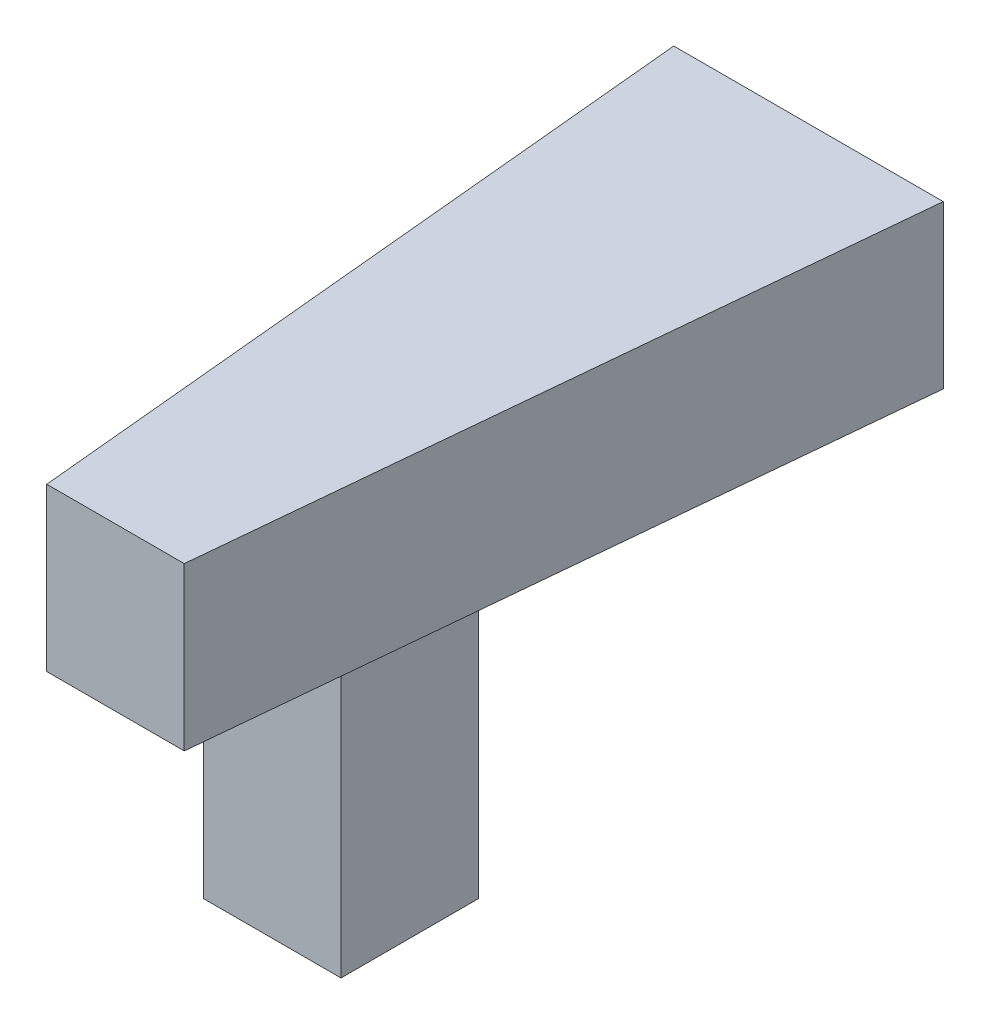
ISO-10303-21;
HEADER;
FILE_DESCRIPTION(('STEP AP214'),'2;1');
FILE_NAME('part.step','',(''),(''),'','','');
FILE_SCHEMA(('AUTOMOTIVE_DESIGN { 1 0 10303 214 1 1 1 1 }'));
ENDSEC;
DATA;
#1=APPLICATION_CONTEXT('core data for automotive mechanical design processes');
#2=APPLICATION_PROTOCOL_DEFINITION('international standard','automotive_design',2000,#1);
#3=PRODUCT_CONTEXT('',#1,'mechanical');
#4=PRODUCT('Part','Part','',(#3));
#5=PRODUCT_RELATED_PRODUCT_CATEGORY('part','',(#4));
#6=PRODUCT_DEFINITION_FORMATION('','',#4);
#7=PRODUCT_DEFINITION_CONTEXT('part definition',#1,'design');
#8=PRODUCT_DEFINITION('design','',#6,#7);
#9=PRODUCT_DEFINITION_SHAPE('','',#8);
#10=(LENGTH_UNIT() NAMED_UNIT(*) SI_UNIT(.MILLI.,.METRE.));
#11=(NAMED_UNIT(*) PLANE_ANGLE_UNIT() SI_UNIT($,.RADIAN.));
#12=(NAMED_UNIT(*) SI_UNIT($,.STERADIAN.) SOLID_ANGLE_UNIT());
#13=UNCERTAINTY_MEASURE_WITH_UNIT(LENGTH_MEASURE(1.E-05),#10,'distance_accuracy_value','');
#14=(GEOMETRIC_REPRESENTATION_CONTEXT(3) GLOBAL_UNCERTAINTY_ASSIGNED_CONTEXT((#13)) GLOBAL_UNIT_ASSIGNED_CONTEXT((#10,
#11,#12)) REPRESENTATION_CONTEXT('',''));
#15=CARTESIAN_POINT('',(0.,0.,0.));
#16=DIRECTION('',(0.,0.,1.));
#17=DIRECTION('',(1.,0.,0.));
#18=AXIS2_PLACEMENT_3D('',#15,#16,#17);
#19=CARTESIAN_POINT('',(-49.,59.,-242.));
#20=DIRECTION('',(0.995495472593952,0.,-0.0948090926279955));
#21=DIRECTION('',(-0.0948090926279955,0.,-0.995495472593952));
#22=AXIS2_PLACEMENT_3D('',#19,#20,#21);
#23=PLANE('',#22);
#24=DIRECTION('',(0.0948090926279955,0.,0.995495472593952));
#25=VECTOR('',#24,1.);
#26=CARTESIAN_POINT('',(-49.,0.,-242.));
#27=LINE('',#26,#25);
#28=CARTESIAN_POINT('',(-49.,0.,-242.));
#29=VERTEX_POINT('',#28);
#30=CARTESIAN_POINT('',(-25.,0.,10.));
#31=VERTEX_POINT('',#30);
#32=EDGE_CURVE('E149',#29,#31,#27,.T.);
#33=ORIENTED_EDGE('',*,*,#32,.T.);
#34=DIRECTION('',(0.,-1.,0.));
#35=VECTOR('',#34,1.);
#36=CARTESIAN_POINT('',(-25.,59.,10.));
#37=LINE('',#36,#35);
#38=CARTESIAN_POINT('',(-25.,59.,10.));
#39=VERTEX_POINT('',#38);
#40=EDGE_CURVE('E11',#39,#31,#37,.T.);
#41=ORIENTED_EDGE('',*,*,#40,.F.);
#42=DIRECTION('',(0.0948090926279955,0.,0.995495472593952));
#43=VECTOR('',#42,1.);
#44=CARTESIAN_POINT('',(-49.,59.,-242.));
#45=LINE('',#44,#43);
#46=CARTESIAN_POINT('',(-49.,59.,-242.));
#47=VERTEX_POINT('',#46);
#48=EDGE_CURVE('E153',#47,#39,#45,.T.);
#49=ORIENTED_EDGE('',*,*,#48,.F.);
#50=DIRECTION('',(0.,-1.,0.));
#51=VECTOR('',#50,1.);
#52=CARTESIAN_POINT('',(-49.,59.,-242.));
#53=LINE('',#52,#51);
#54=EDGE_CURVE('E159',#47,#29,#53,.T.);
#55=ORIENTED_EDGE('',*,*,#54,.T.);
#56=EDGE_LOOP('',(#33,#41,#49,#55));
#57=FACE_BOUND('',#56,.T.);
#58=ADVANCED_FACE('F39',(#57),#23,.F.);
#59=CARTESIAN_POINT('',(-25.,59.,10.));
#60=DIRECTION('',(0.,0.,-1.));
#61=DIRECTION('',(-1.,0.,0.));
#62=AXIS2_PLACEMENT_3D('',#59,#60,#61);
#63=PLANE('',#62);
#64=DIRECTION('',(1.,0.,0.));
#65=VECTOR('',#64,1.);
#66=CARTESIAN_POINT('',(-25.,0.,10.));
#67=LINE('',#66,#65);
#68=CARTESIAN_POINT('',(25.,0.,10.));
#69=VERTEX_POINT('',#68);
#70=EDGE_CURVE('E162',#31,#69,#67,.T.);
#71=ORIENTED_EDGE('',*,*,#70,.T.);
#72=DIRECTION('',(0.,-1.,0.));
#73=VECTOR('',#72,1.);
#74=CARTESIAN_POINT('',(25.,59.,10.));
#75=LINE('',#74,#73);
#76=CARTESIAN_POINT('',(25.,59.,10.));
#77=VERTEX_POINT('',#76);
#78=EDGE_CURVE('E46',#77,#69,#75,.T.);
#79=ORIENTED_EDGE('',*,*,#78,.F.);
#80=DIRECTION('',(1.,0.,0.));
#81=VECTOR('',#80,1.);
#82=CARTESIAN_POINT('',(-25.,59.,10.));
#83=LINE('',#82,#81);
#84=EDGE_CURVE('E90',#39,#77,#83,.T.);
#85=ORIENTED_EDGE('',*,*,#84,.F.);
#86=ORIENTED_EDGE('',*,*,#40,.T.);
#87=EDGE_LOOP('',(#71,#79,#85,#86));
#88=FACE_BOUND('',#87,.T.);
#89=ADVANCED_FACE('F190',(#88),#63,.F.);
#90=CARTESIAN_POINT('',(49.,59.,-242.));
#91=DIRECTION('',(-0.995495472593952,0.,-0.0948090926279955));
#92=DIRECTION('',(-0.0948090926279955,0.,0.995495472593952));
#93=AXIS2_PLACEMENT_3D('',#90,#91,#92);
#94=PLANE('',#93);
#95=DIRECTION('',(0.0948090926279955,0.,-0.995495472593952));
#96=VECTOR('',#95,1.);
#97=CARTESIAN_POINT('',(49.,0.,-242.));
#98=LINE('',#97,#96);
#99=CARTESIAN_POINT('',(49.,0.,-242.));
#100=VERTEX_POINT('',#99);
#101=EDGE_CURVE('E164',#69,#100,#98,.T.);
#102=ORIENTED_EDGE('',*,*,#101,.T.);
#103=DIRECTION('',(0.,-1.,0.));
#104=VECTOR('',#103,1.);
#105=CARTESIAN_POINT('',(49.,59.,-242.));
#106=LINE('',#105,#104);
#107=CARTESIAN_POINT('',(49.,59.,-242.));
#108=VERTEX_POINT('',#107);
#109=EDGE_CURVE('E168',#108,#100,#106,.T.);
#110=ORIENTED_EDGE('',*,*,#109,.F.);
#111=DIRECTION('',(0.0948090926279955,0.,-0.995495472593952));
#112=VECTOR('',#111,1.);
#113=CARTESIAN_POINT('',(49.,59.,-242.));
#114=LINE('',#113,#112);
#115=EDGE_CURVE('E156',#77,#108,#114,.T.);
#116=ORIENTED_EDGE('',*,*,#115,.F.);
#117=ORIENTED_EDGE('',*,*,#78,.T.);
#118=EDGE_LOOP('',(#102,#110,#116,#117));
#119=FACE_BOUND('',#118,.T.);
#120=ADVANCED_FACE('F173',(#119),#94,.F.);
#121=CARTESIAN_POINT('',(-49.,59.,-242.));
#122=DIRECTION('',(0.,0.,1.));
#123=DIRECTION('',(1.,0.,0.));
#124=AXIS2_PLACEMENT_3D('',#121,#122,#123);
#125=PLANE('',#124);
#126=DIRECTION('',(-1.,0.,0.));
#127=VECTOR('',#126,1.);
#128=CARTESIAN_POINT('',(-49.,0.,-242.));
#129=LINE('',#128,#127);
#130=EDGE_CURVE('E83',#100,#29,#129,.T.);
#131=ORIENTED_EDGE('',*,*,#130,.T.);
#132=ORIENTED_EDGE('',*,*,#54,.F.);
#133=DIRECTION('',(-1.,0.,0.));
#134=VECTOR('',#133,1.);
#135=CARTESIAN_POINT('',(-49.,59.,-242.));
#136=LINE('',#135,#134);
#137=EDGE_CURVE('E62',#108,#47,#136,.T.);
#138=ORIENTED_EDGE('',*,*,#137,.F.);
#139=ORIENTED_EDGE('',*,*,#109,.T.);
#140=EDGE_LOOP('',(#131,#132,#138,#139));
#141=FACE_BOUND('',#140,.T.);
#142=ADVANCED_FACE('F181',(#141),#125,.F.);
#143=CARTESIAN_POINT('',(0.,59.,0.));
#144=DIRECTION('',(0.,1.,0.));
#145=DIRECTION('',(0.,0.,1.));
#146=AXIS2_PLACEMENT_3D('',#143,#144,#145);
#147=PLANE('',#146);
#148=ORIENTED_EDGE('',*,*,#48,.T.);
#149=ORIENTED_EDGE('',*,*,#84,.T.);
#150=ORIENTED_EDGE('',*,*,#115,.T.);
#151=ORIENTED_EDGE('',*,*,#137,.T.);
#152=EDGE_LOOP('',(#148,#149,#150,#151));
#153=FACE_BOUND('',#152,.T.);
#154=ADVANCED_FACE('F183',(#153),#147,.T.);
#155=CARTESIAN_POINT('',(0.,0.,0.));
#156=DIRECTION('',(0.,1.,0.));
#157=DIRECTION('',(0.,0.,1.));
#158=AXIS2_PLACEMENT_3D('',#155,#156,#157);
#159=PLANE('',#158);
#160=DIRECTION('',(1.,0.,0.));
#161=VECTOR('',#160,1.);
#162=CARTESIAN_POINT('',(-25.,0.,-47.));
#163=LINE('',#162,#161);
#164=CARTESIAN_POINT('',(-25.,0.,-47.));
#165=VERTEX_POINT('',#164);
#166=CARTESIAN_POINT('',(25.,0.,-47.));
#167=VERTEX_POINT('',#166);
#168=EDGE_CURVE('E137',#165,#167,#163,.T.);
#169=ORIENTED_EDGE('',*,*,#168,.T.);
#170=DIRECTION('',(0.,0.,-1.));
#171=VECTOR('',#170,1.);
#172=CARTESIAN_POINT('',(25.,0.,-97.));
#173=LINE('',#172,#171);
#174=CARTESIAN_POINT('',(25.,0.,-97.));
#175=VERTEX_POINT('',#174);
#176=EDGE_CURVE('E144',#167,#175,#173,.T.);
#177=ORIENTED_EDGE('',*,*,#176,.T.);
#178=DIRECTION('',(-1.,0.,0.));
#179=VECTOR('',#178,1.);
#180=CARTESIAN_POINT('',(-25.,0.,-97.));
#181=LINE('',#180,#179);
#182=CARTESIAN_POINT('',(-25.,0.,-97.));
#183=VERTEX_POINT('',#182);
#184=EDGE_CURVE('E117',#175,#183,#181,.T.);
#185=ORIENTED_EDGE('',*,*,#184,.T.);
#186=DIRECTION('',(0.,0.,1.));
#187=VECTOR('',#186,1.);
#188=CARTESIAN_POINT('',(-25.,0.,-97.));
#189=LINE('',#188,#187);
#190=EDGE_CURVE('E53',#183,#165,#189,.T.);
#191=ORIENTED_EDGE('',*,*,#190,.T.);
#192=EDGE_LOOP('',(#169,#177,#185,#191));
#193=FACE_BOUND('',#192,.T.);
#194=ORIENTED_EDGE('',*,*,#32,.F.);
#195=ORIENTED_EDGE('',*,*,#130,.F.);
#196=ORIENTED_EDGE('',*,*,#101,.F.);
#197=ORIENTED_EDGE('',*,*,#70,.F.);
#198=EDGE_LOOP('',(#194,#195,#196,#197));
#199=FACE_BOUND('',#198,.T.);
#200=ADVANCED_FACE('F177',(#193,#199),#159,.F.);
#201=CARTESIAN_POINT('',(25.,-100.,-97.));
#202=DIRECTION('',(1.,0.,0.));
#203=DIRECTION('',(0.,0.,-1.));
#204=AXIS2_PLACEMENT_3D('',#201,#202,#203);
#205=PLANE('',#204);
#206=ORIENTED_EDGE('',*,*,#176,.F.);
#207=DIRECTION('',(0.,1.,0.));
#208=VECTOR('',#207,1.);
#209=CARTESIAN_POINT('',(25.,-100.,-47.));
#210=LINE('',#209,#208);
#211=CARTESIAN_POINT('',(25.,-100.,-47.));
#212=VERTEX_POINT('',#211);
#213=EDGE_CURVE('E136',#212,#167,#210,.T.);
#214=ORIENTED_EDGE('',*,*,#213,.F.);
#215=DIRECTION('',(0.,0.,-1.));
#216=VECTOR('',#215,1.);
#217=CARTESIAN_POINT('',(25.,-100.,-97.));
#218=LINE('',#217,#216);
#219=CARTESIAN_POINT('',(25.,-100.,-97.));
#220=VERTEX_POINT('',#219);
#221=EDGE_CURVE('E130',#212,#220,#218,.T.);
#222=ORIENTED_EDGE('',*,*,#221,.T.);
#223=DIRECTION('',(0.,1.,0.));
#224=VECTOR('',#223,1.);
#225=CARTESIAN_POINT('',(25.,-100.,-97.));
#226=LINE('',#225,#224);
#227=EDGE_CURVE('E112',#220,#175,#226,.T.);
#228=ORIENTED_EDGE('',*,*,#227,.T.);
#229=EDGE_LOOP('',(#206,#214,#222,#228));
#230=FACE_BOUND('',#229,.T.);
#231=ADVANCED_FACE('F135',(#230),#205,.T.);
#232=CARTESIAN_POINT('',(-25.,-100.,-47.));
#233=DIRECTION('',(0.,0.,1.));
#234=DIRECTION('',(1.,0.,0.));
#235=AXIS2_PLACEMENT_3D('',#232,#233,#234);
#236=PLANE('',#235);
#237=ORIENTED_EDGE('',*,*,#168,.F.);
#238=DIRECTION('',(0.,1.,0.));
#239=VECTOR('',#238,1.);
#240=CARTESIAN_POINT('',(-25.,-100.,-47.));
#241=LINE('',#240,#239);
#242=CARTESIAN_POINT('',(-25.,-100.,-47.));
#243=VERTEX_POINT('',#242);
#244=EDGE_CURVE('E150',#243,#165,#241,.T.);
#245=ORIENTED_EDGE('',*,*,#244,.F.);
#246=DIRECTION('',(1.,0.,0.));
#247=VECTOR('',#246,1.);
#248=CARTESIAN_POINT('',(-25.,-100.,-47.));
#249=LINE('',#248,#247);
#250=EDGE_CURVE('E123',#243,#212,#249,.T.);
#251=ORIENTED_EDGE('',*,*,#250,.T.);
#252=ORIENTED_EDGE('',*,*,#213,.T.);
#253=EDGE_LOOP('',(#237,#245,#251,#252));
#254=FACE_BOUND('',#253,.T.);
#255=ADVANCED_FACE('F232',(#254),#236,.T.);
#256=CARTESIAN_POINT('',(-25.,-100.,-97.));
#257=DIRECTION('',(-1.,0.,0.));
#258=DIRECTION('',(0.,0.,1.));
#259=AXIS2_PLACEMENT_3D('',#256,#257,#258);
#260=PLANE('',#259);
#261=ORIENTED_EDGE('',*,*,#190,.F.);
#262=DIRECTION('',(0.,1.,0.));
#263=VECTOR('',#262,1.);
#264=CARTESIAN_POINT('',(-25.,-100.,-97.));
#265=LINE('',#264,#263);
#266=CARTESIAN_POINT('',(-25.,-100.,-97.));
#267=VERTEX_POINT('',#266);
#268=EDGE_CURVE('E122',#267,#183,#265,.T.);
#269=ORIENTED_EDGE('',*,*,#268,.F.);
#270=DIRECTION('',(0.,0.,1.));
#271=VECTOR('',#270,1.);
#272=CARTESIAN_POINT('',(-25.,-100.,-97.));
#273=LINE('',#272,#271);
#274=EDGE_CURVE('E133',#267,#243,#273,.T.);
#275=ORIENTED_EDGE('',*,*,#274,.T.);
#276=ORIENTED_EDGE('',*,*,#244,.T.);
#277=EDGE_LOOP('',(#261,#269,#275,#276));
#278=FACE_BOUND('',#277,.T.);
#279=ADVANCED_FACE('F241',(#278),#260,.T.);
#280=CARTESIAN_POINT('',(-25.,-100.,-97.));
#281=DIRECTION('',(0.,0.,-1.));
#282=DIRECTION('',(-1.,0.,0.));
#283=AXIS2_PLACEMENT_3D('',#280,#281,#282);
#284=PLANE('',#283);
#285=ORIENTED_EDGE('',*,*,#184,.F.);
#286=ORIENTED_EDGE('',*,*,#227,.F.);
#287=DIRECTION('',(-1.,0.,0.));
#288=VECTOR('',#287,1.);
#289=CARTESIAN_POINT('',(-25.,-100.,-97.));
#290=LINE('',#289,#288);
#291=EDGE_CURVE('E115',#220,#267,#290,.T.);
#292=ORIENTED_EDGE('',*,*,#291,.T.);
#293=ORIENTED_EDGE('',*,*,#268,.T.);
#294=EDGE_LOOP('',(#285,#286,#292,#293));
#295=FACE_BOUND('',#294,.T.);
#296=ADVANCED_FACE('F114',(#295),#284,.T.);
#297=CARTESIAN_POINT('',(0.,-100.,0.));
#298=DIRECTION('',(0.,1.,0.));
#299=DIRECTION('',(0.,0.,1.));
#300=AXIS2_PLACEMENT_3D('',#297,#298,#299);
#301=PLANE('',#300);
#302=ORIENTED_EDGE('',*,*,#221,.F.);
#303=ORIENTED_EDGE('',*,*,#250,.F.);
#304=ORIENTED_EDGE('',*,*,#274,.F.);
#305=ORIENTED_EDGE('',*,*,#291,.F.);
#306=EDGE_LOOP('',(#302,#303,#304,#305));
#307=FACE_BOUND('',#306,.T.);
#308=ADVANCED_FACE('F128',(#307),#301,.F.);
#309=CLOSED_SHELL('',(#58,#89,#120,#142,#154,#200,#231,#255,#279,#296,#308));
#310=MANIFOLD_SOLID_BREP('B2',#309);
#311=ADVANCED_BREP_SHAPE_REPRESENTATION('',(#18,#310),#14);
#312=SHAPE_DEFINITION_REPRESENTATION(#9,#311);
ENDSEC;
END-ISO-10303-21;
